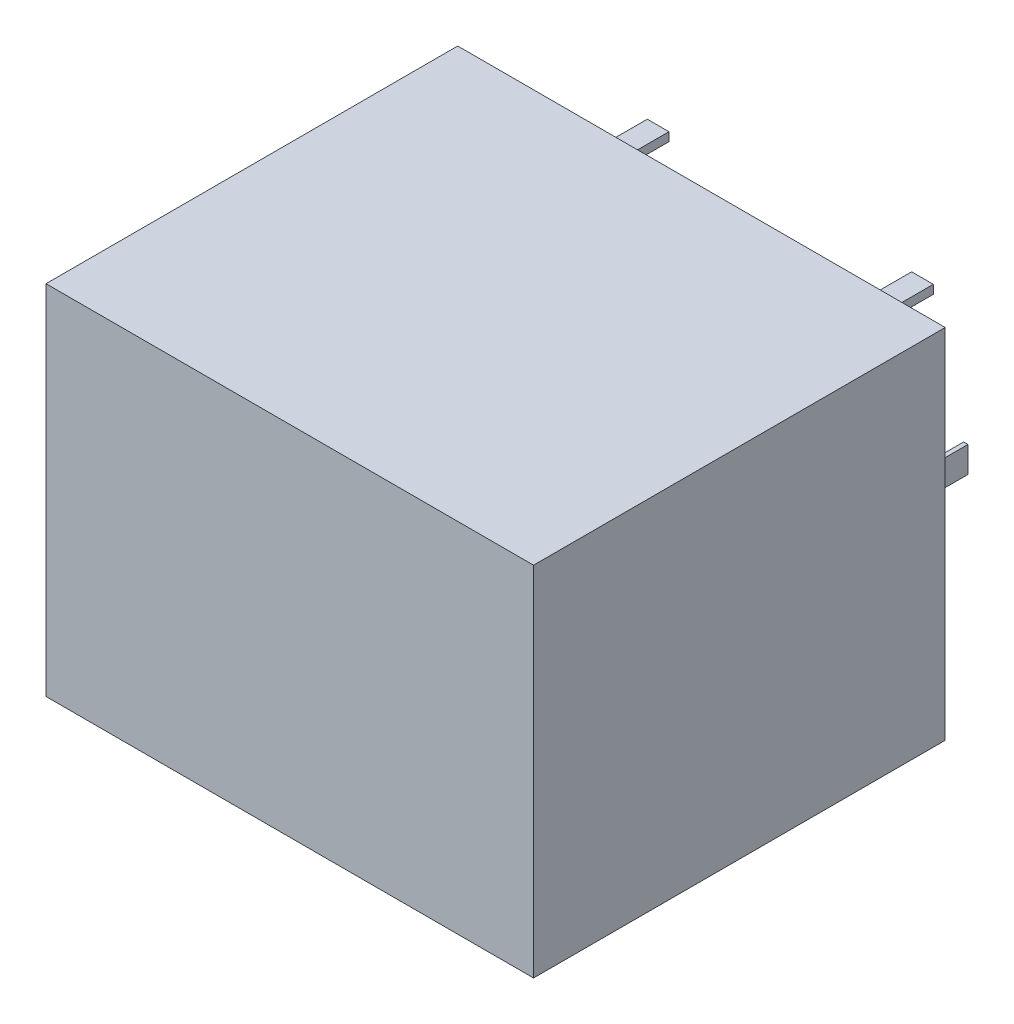
ISO-10303-21;
HEADER;
FILE_DESCRIPTION(('STEP AP214'),'2;1');
FILE_NAME('part.step','',(''),(''),'','','');
FILE_SCHEMA(('AUTOMOTIVE_DESIGN { 1 0 10303 214 1 1 1 1 }'));
ENDSEC;
DATA;
#1=APPLICATION_CONTEXT('core data for automotive mechanical design processes');
#2=APPLICATION_PROTOCOL_DEFINITION('international standard','automotive_design',2000,#1);
#3=PRODUCT_CONTEXT('',#1,'mechanical');
#4=PRODUCT('Part','Part','',(#3));
#5=PRODUCT_RELATED_PRODUCT_CATEGORY('part','',(#4));
#6=PRODUCT_DEFINITION_FORMATION('','',#4);
#7=PRODUCT_DEFINITION_CONTEXT('part definition',#1,'design');
#8=PRODUCT_DEFINITION('design','',#6,#7);
#9=PRODUCT_DEFINITION_SHAPE('','',#8);
#10=(LENGTH_UNIT() NAMED_UNIT(*) SI_UNIT(.MILLI.,.METRE.));
#11=(NAMED_UNIT(*) PLANE_ANGLE_UNIT() SI_UNIT($,.RADIAN.));
#12=(NAMED_UNIT(*) SI_UNIT($,.STERADIAN.) SOLID_ANGLE_UNIT());
#13=UNCERTAINTY_MEASURE_WITH_UNIT(LENGTH_MEASURE(1.E-05),#10,'distance_accuracy_value','');
#14=(GEOMETRIC_REPRESENTATION_CONTEXT(3) GLOBAL_UNCERTAINTY_ASSIGNED_CONTEXT((#13)) GLOBAL_UNIT_ASSIGNED_CONTEXT((#10,
#11,#12)) REPRESENTATION_CONTEXT('',''));
#15=CARTESIAN_POINT('',(0.,0.,0.));
#16=DIRECTION('',(0.,0.,1.));
#17=DIRECTION('',(1.,0.,0.));
#18=AXIS2_PLACEMENT_3D('',#15,#16,#17);
#19=CARTESIAN_POINT('',(-15.705,-5.76,-0.75));
#20=DIRECTION('',(0.,1.,0.));
#21=DIRECTION('',(0.,0.,1.));
#22=AXIS2_PLACEMENT_3D('',#19,#20,#21);
#23=PLANE('',#22);
#24=DIRECTION('',(1.,0.,0.));
#25=VECTOR('',#24,1.);
#26=CARTESIAN_POINT('',(-15.705,-5.76,-3.25));
#27=LINE('',#26,#25);
#28=CARTESIAN_POINT('',(-15.205,-5.76,-3.25));
#29=VERTEX_POINT('',#28);
#30=CARTESIAN_POINT('',(-16.205,-5.76,-3.25));
#31=VERTEX_POINT('',#30);
#32=EDGE_CURVE('E190',#29,#31,#27,.F.);
#33=ORIENTED_EDGE('',*,*,#32,.T.);
#34=DIRECTION('',(0.,0.,1.));
#35=VECTOR('',#34,1.);
#36=CARTESIAN_POINT('',(-16.205,-5.76,-0.75));
#37=LINE('',#36,#35);
#38=CARTESIAN_POINT('',(-16.205,-5.76,0.249999999999999));
#39=VERTEX_POINT('',#38);
#40=EDGE_CURVE('E179',#31,#39,#37,.T.);
#41=ORIENTED_EDGE('',*,*,#40,.T.);
#42=DIRECTION('',(1.,0.,0.));
#43=VECTOR('',#42,1.);
#44=CARTESIAN_POINT('',(-15.705,-5.76,0.25));
#45=LINE('',#44,#43);
#46=CARTESIAN_POINT('',(-15.205,-5.76,0.249999999999999));
#47=VERTEX_POINT('',#46);
#48=EDGE_CURVE('E18',#39,#47,#45,.T.);
#49=ORIENTED_EDGE('',*,*,#48,.T.);
#50=DIRECTION('',(0.,0.,1.));
#51=VECTOR('',#50,1.);
#52=CARTESIAN_POINT('',(-15.205,-5.76,-0.75));
#53=LINE('',#52,#51);
#54=EDGE_CURVE('E174',#47,#29,#53,.F.);
#55=ORIENTED_EDGE('',*,*,#54,.T.);
#56=EDGE_LOOP('',(#33,#41,#49,#55));
#57=FACE_BOUND('',#56,.T.);
#58=ADVANCED_FACE('F15',(#57),#23,.T.);
#59=CARTESIAN_POINT('',(-15.705,6.24,-0.75));
#60=DIRECTION('',(0.,1.,0.));
#61=DIRECTION('',(0.,0.,1.));
#62=AXIS2_PLACEMENT_3D('',#59,#60,#61);
#63=PLANE('',#62);
#64=DIRECTION('',(1.,0.,0.));
#65=VECTOR('',#64,1.);
#66=CARTESIAN_POINT('',(-15.705,6.24,-3.25));
#67=LINE('',#66,#65);
#68=CARTESIAN_POINT('',(-15.205,6.24,-3.25));
#69=VERTEX_POINT('',#68);
#70=CARTESIAN_POINT('',(-16.205,6.24,-3.25));
#71=VERTEX_POINT('',#70);
#72=EDGE_CURVE('E221',#69,#71,#67,.F.);
#73=ORIENTED_EDGE('',*,*,#72,.T.);
#74=DIRECTION('',(0.,0.,1.));
#75=VECTOR('',#74,1.);
#76=CARTESIAN_POINT('',(-16.205,6.24,-0.75));
#77=LINE('',#76,#75);
#78=CARTESIAN_POINT('',(-16.205,6.24,0.250000000000001));
#79=VERTEX_POINT('',#78);
#80=EDGE_CURVE('E212',#71,#79,#77,.T.);
#81=ORIENTED_EDGE('',*,*,#80,.T.);
#82=DIRECTION('',(1.,0.,0.));
#83=VECTOR('',#82,1.);
#84=CARTESIAN_POINT('',(-15.705,6.24,0.25));
#85=LINE('',#84,#83);
#86=CARTESIAN_POINT('',(-15.205,6.24,0.250000000000001));
#87=VERTEX_POINT('',#86);
#88=EDGE_CURVE('E182',#79,#87,#85,.T.);
#89=ORIENTED_EDGE('',*,*,#88,.T.);
#90=DIRECTION('',(0.,0.,1.));
#91=VECTOR('',#90,1.);
#92=CARTESIAN_POINT('',(-15.205,6.24,-0.75));
#93=LINE('',#92,#91);
#94=EDGE_CURVE('E209',#87,#69,#93,.F.);
#95=ORIENTED_EDGE('',*,*,#94,.T.);
#96=EDGE_LOOP('',(#73,#81,#89,#95));
#97=FACE_BOUND('',#96,.T.);
#98=ADVANCED_FACE('F207',(#97),#63,.T.);
#99=CARTESIAN_POINT('',(-3.505,6.24,-0.75));
#100=DIRECTION('',(0.,1.,0.));
#101=DIRECTION('',(0.,0.,1.));
#102=AXIS2_PLACEMENT_3D('',#99,#100,#101);
#103=PLANE('',#102);
#104=DIRECTION('',(1.,0.,0.));
#105=VECTOR('',#104,1.);
#106=CARTESIAN_POINT('',(-3.505,6.24,-3.25));
#107=LINE('',#106,#105);
#108=CARTESIAN_POINT('',(-3.005,6.24,-3.25));
#109=VERTEX_POINT('',#108);
#110=CARTESIAN_POINT('',(-4.005,6.24,-3.25));
#111=VERTEX_POINT('',#110);
#112=EDGE_CURVE('E342',#109,#111,#107,.F.);
#113=ORIENTED_EDGE('',*,*,#112,.T.);
#114=DIRECTION('',(0.,0.,1.));
#115=VECTOR('',#114,1.);
#116=CARTESIAN_POINT('',(-4.005,6.24,-0.75));
#117=LINE('',#116,#115);
#118=CARTESIAN_POINT('',(-4.005,6.24,0.250000000000001));
#119=VERTEX_POINT('',#118);
#120=EDGE_CURVE('E333',#111,#119,#117,.T.);
#121=ORIENTED_EDGE('',*,*,#120,.T.);
#122=DIRECTION('',(1.,0.,0.));
#123=VECTOR('',#122,1.);
#124=CARTESIAN_POINT('',(-3.505,6.24,0.25));
#125=LINE('',#124,#123);
#126=CARTESIAN_POINT('',(-3.005,6.24,0.250000000000001));
#127=VERTEX_POINT('',#126);
#128=EDGE_CURVE('E203',#119,#127,#125,.T.);
#129=ORIENTED_EDGE('',*,*,#128,.T.);
#130=DIRECTION('',(0.,0.,1.));
#131=VECTOR('',#130,1.);
#132=CARTESIAN_POINT('',(-3.005,6.24,-0.75));
#133=LINE('',#132,#131);
#134=EDGE_CURVE('E347',#127,#109,#133,.F.);
#135=ORIENTED_EDGE('',*,*,#134,.T.);
#136=EDGE_LOOP('',(#113,#121,#129,#135));
#137=FACE_BOUND('',#136,.T.);
#138=ADVANCED_FACE('F518',(#137),#103,.T.);
#139=CARTESIAN_POINT('',(-3.505,-5.76,-0.75));
#140=DIRECTION('',(0.,1.,0.));
#141=DIRECTION('',(0.,0.,1.));
#142=AXIS2_PLACEMENT_3D('',#139,#140,#141);
#143=PLANE('',#142);
#144=DIRECTION('',(1.,0.,0.));
#145=VECTOR('',#144,1.);
#146=CARTESIAN_POINT('',(-3.505,-5.76,-3.25));
#147=LINE('',#146,#145);
#148=CARTESIAN_POINT('',(-3.005,-5.76,-3.25));
#149=VERTEX_POINT('',#148);
#150=CARTESIAN_POINT('',(-4.005,-5.76,-3.25));
#151=VERTEX_POINT('',#150);
#152=EDGE_CURVE('E324',#149,#151,#147,.F.);
#153=ORIENTED_EDGE('',*,*,#152,.T.);
#154=DIRECTION('',(0.,0.,1.));
#155=VECTOR('',#154,1.);
#156=CARTESIAN_POINT('',(-4.005,-5.76,-0.75));
#157=LINE('',#156,#155);
#158=CARTESIAN_POINT('',(-4.005,-5.76,0.249999999999999));
#159=VERTEX_POINT('',#158);
#160=EDGE_CURVE('E315',#151,#159,#157,.T.);
#161=ORIENTED_EDGE('',*,*,#160,.T.);
#162=DIRECTION('',(1.,0.,0.));
#163=VECTOR('',#162,1.);
#164=CARTESIAN_POINT('',(-3.505,-5.76,0.25));
#165=LINE('',#164,#163);
#166=CARTESIAN_POINT('',(-3.005,-5.76,0.249999999999999));
#167=VERTEX_POINT('',#166);
#168=EDGE_CURVE('E198',#159,#167,#165,.T.);
#169=ORIENTED_EDGE('',*,*,#168,.T.);
#170=DIRECTION('',(0.,0.,1.));
#171=VECTOR('',#170,1.);
#172=CARTESIAN_POINT('',(-3.005,-5.76,-0.75));
#173=LINE('',#172,#171);
#174=EDGE_CURVE('E329',#167,#149,#173,.F.);
#175=ORIENTED_EDGE('',*,*,#174,.T.);
#176=EDGE_LOOP('',(#153,#161,#169,#175));
#177=FACE_BOUND('',#176,.T.);
#178=ADVANCED_FACE('F515',(#177),#143,.T.);
#179=CARTESIAN_POINT('',(-1.505,0.64,-0.75));
#180=DIRECTION('',(0.,1.,0.));
#181=DIRECTION('',(0.,0.,1.));
#182=AXIS2_PLACEMENT_3D('',#179,#180,#181);
#183=PLANE('',#182);
#184=DIRECTION('',(1.,0.,0.));
#185=VECTOR('',#184,1.);
#186=CARTESIAN_POINT('',(-1.505,0.64,-3.25));
#187=LINE('',#186,#185);
#188=CARTESIAN_POINT('',(-1.405,0.640000000000001,-3.25));
#189=VERTEX_POINT('',#188);
#190=CARTESIAN_POINT('',(-1.605,0.640000000000001,-3.25));
#191=VERTEX_POINT('',#190);
#192=EDGE_CURVE('E306',#189,#191,#187,.F.);
#193=ORIENTED_EDGE('',*,*,#192,.T.);
#194=DIRECTION('',(0.,0.,1.));
#195=VECTOR('',#194,1.);
#196=CARTESIAN_POINT('',(-1.605,0.64,-0.75));
#197=LINE('',#196,#195);
#198=CARTESIAN_POINT('',(-1.605,0.64,0.25));
#199=VERTEX_POINT('',#198);
#200=EDGE_CURVE('E297',#191,#199,#197,.T.);
#201=ORIENTED_EDGE('',*,*,#200,.T.);
#202=DIRECTION('',(1.,0.,0.));
#203=VECTOR('',#202,1.);
#204=CARTESIAN_POINT('',(-1.505,0.639999999999999,0.25));
#205=LINE('',#204,#203);
#206=CARTESIAN_POINT('',(-1.405,0.64,0.25));
#207=VERTEX_POINT('',#206);
#208=EDGE_CURVE('E196',#199,#207,#205,.T.);
#209=ORIENTED_EDGE('',*,*,#208,.T.);
#210=DIRECTION('',(0.,0.,1.));
#211=VECTOR('',#210,1.);
#212=CARTESIAN_POINT('',(-1.405,0.64,-0.75));
#213=LINE('',#212,#211);
#214=EDGE_CURVE('E311',#207,#189,#213,.F.);
#215=ORIENTED_EDGE('',*,*,#214,.T.);
#216=EDGE_LOOP('',(#193,#201,#209,#215));
#217=FACE_BOUND('',#216,.T.);
#218=ADVANCED_FACE('F465',(#217),#183,.T.);
#219=CARTESIAN_POINT('',(-15.205,-5.96,-0.75));
#220=DIRECTION('',(-1.,0.,0.));
#221=DIRECTION('',(0.,-1.,0.));
#222=AXIS2_PLACEMENT_3D('',#219,#220,#221);
#223=PLANE('',#222);
#224=DIRECTION('',(0.,0.,1.));
#225=VECTOR('',#224,1.);
#226=CARTESIAN_POINT('',(-15.205,-6.16,-0.75));
#227=LINE('',#226,#225);
#228=CARTESIAN_POINT('',(-15.205,-6.16,0.249999999999999));
#229=VERTEX_POINT('',#228);
#230=CARTESIAN_POINT('',(-15.205,-6.16,-3.25));
#231=VERTEX_POINT('',#230);
#232=EDGE_CURVE('E250',#229,#231,#227,.F.);
#233=ORIENTED_EDGE('',*,*,#232,.T.);
#234=DIRECTION('',(0.,-1.,0.));
#235=VECTOR('',#234,1.);
#236=CARTESIAN_POINT('',(-15.205,-5.96,-3.25));
#237=LINE('',#236,#235);
#238=EDGE_CURVE('E194',#231,#29,#237,.F.);
#239=ORIENTED_EDGE('',*,*,#238,.T.);
#240=ORIENTED_EDGE('',*,*,#54,.F.);
#241=DIRECTION('',(0.,-1.,0.));
#242=VECTOR('',#241,1.);
#243=CARTESIAN_POINT('',(-15.205,-5.96,0.25));
#244=LINE('',#243,#242);
#245=EDGE_CURVE('E184',#229,#47,#244,.F.);
#246=ORIENTED_EDGE('',*,*,#245,.F.);
#247=EDGE_LOOP('',(#233,#239,#240,#246));
#248=FACE_BOUND('',#247,.T.);
#249=ADVANCED_FACE('F192',(#248),#223,.F.);
#250=CARTESIAN_POINT('',(-15.705,-5.96,-3.25));
#251=DIRECTION('',(0.,0.,1.));
#252=DIRECTION('',(0.,-1.,0.));
#253=AXIS2_PLACEMENT_3D('',#250,#251,#252);
#254=PLANE('',#253);
#255=DIRECTION('',(1.,0.,0.));
#256=VECTOR('',#255,1.);
#257=CARTESIAN_POINT('',(-15.705,-6.16,-3.25));
#258=LINE('',#257,#256);
#259=CARTESIAN_POINT('',(-16.205,-6.16,-3.25));
#260=VERTEX_POINT('',#259);
#261=EDGE_CURVE('E240',#231,#260,#258,.F.);
#262=ORIENTED_EDGE('',*,*,#261,.T.);
#263=DIRECTION('',(0.,1.,0.));
#264=VECTOR('',#263,1.);
#265=CARTESIAN_POINT('',(-16.205,-5.96,-3.25));
#266=LINE('',#265,#264);
#267=EDGE_CURVE('E233',#260,#31,#266,.T.);
#268=ORIENTED_EDGE('',*,*,#267,.T.);
#269=ORIENTED_EDGE('',*,*,#32,.F.);
#270=ORIENTED_EDGE('',*,*,#238,.F.);
#271=EDGE_LOOP('',(#262,#268,#269,#270));
#272=FACE_BOUND('',#271,.T.);
#273=ADVANCED_FACE('F238',(#272),#254,.F.);
#274=CARTESIAN_POINT('',(-16.205,-5.96,-0.75));
#275=DIRECTION('',(1.,0.,0.));
#276=DIRECTION('',(0.,1.,0.));
#277=AXIS2_PLACEMENT_3D('',#274,#275,#276);
#278=PLANE('',#277);
#279=ORIENTED_EDGE('',*,*,#40,.F.);
#280=ORIENTED_EDGE('',*,*,#267,.F.);
#281=DIRECTION('',(0.,0.,1.));
#282=VECTOR('',#281,1.);
#283=CARTESIAN_POINT('',(-16.205,-6.16,-0.75));
#284=LINE('',#283,#282);
#285=CARTESIAN_POINT('',(-16.205,-6.16,0.249999999999999));
#286=VERTEX_POINT('',#285);
#287=EDGE_CURVE('E245',#260,#286,#284,.T.);
#288=ORIENTED_EDGE('',*,*,#287,.T.);
#289=DIRECTION('',(0.,1.,0.));
#290=VECTOR('',#289,1.);
#291=CARTESIAN_POINT('',(-16.205,-5.96,0.25));
#292=LINE('',#291,#290);
#293=EDGE_CURVE('E227',#39,#286,#292,.F.);
#294=ORIENTED_EDGE('',*,*,#293,.F.);
#295=EDGE_LOOP('',(#279,#280,#288,#294));
#296=FACE_BOUND('',#295,.T.);
#297=ADVANCED_FACE('F244',(#296),#278,.F.);
#298=CARTESIAN_POINT('',(-15.205,6.04,-0.75));
#299=DIRECTION('',(-1.,0.,0.));
#300=DIRECTION('',(0.,-1.,0.));
#301=AXIS2_PLACEMENT_3D('',#298,#299,#300);
#302=PLANE('',#301);
#303=DIRECTION('',(0.,0.,1.));
#304=VECTOR('',#303,1.);
#305=CARTESIAN_POINT('',(-15.205,5.84,-0.75));
#306=LINE('',#305,#304);
#307=CARTESIAN_POINT('',(-15.205,5.84,0.250000000000001));
#308=VERTEX_POINT('',#307);
#309=CARTESIAN_POINT('',(-15.205,5.84,-3.25));
#310=VERTEX_POINT('',#309);
#311=EDGE_CURVE('E247',#308,#310,#306,.F.);
#312=ORIENTED_EDGE('',*,*,#311,.T.);
#313=DIRECTION('',(0.,-1.,0.));
#314=VECTOR('',#313,1.);
#315=CARTESIAN_POINT('',(-15.205,6.04,-3.25));
#316=LINE('',#315,#314);
#317=EDGE_CURVE('E225',#310,#69,#316,.F.);
#318=ORIENTED_EDGE('',*,*,#317,.T.);
#319=ORIENTED_EDGE('',*,*,#94,.F.);
#320=DIRECTION('',(0.,-1.,0.));
#321=VECTOR('',#320,1.);
#322=CARTESIAN_POINT('',(-15.205,6.04,0.25));
#323=LINE('',#322,#321);
#324=EDGE_CURVE('E216',#308,#87,#323,.F.);
#325=ORIENTED_EDGE('',*,*,#324,.F.);
#326=EDGE_LOOP('',(#312,#318,#319,#325));
#327=FACE_BOUND('',#326,.T.);
#328=ADVANCED_FACE('F223',(#327),#302,.F.);
#329=CARTESIAN_POINT('',(-15.705,6.04,-3.25));
#330=DIRECTION('',(0.,0.,1.));
#331=DIRECTION('',(0.,-1.,0.));
#332=AXIS2_PLACEMENT_3D('',#329,#330,#331);
#333=PLANE('',#332);
#334=DIRECTION('',(1.,0.,0.));
#335=VECTOR('',#334,1.);
#336=CARTESIAN_POINT('',(-15.705,5.84,-3.25));
#337=LINE('',#336,#335);
#338=CARTESIAN_POINT('',(-16.205,5.84,-3.25));
#339=VERTEX_POINT('',#338);
#340=EDGE_CURVE('E290',#310,#339,#337,.F.);
#341=ORIENTED_EDGE('',*,*,#340,.T.);
#342=DIRECTION('',(0.,1.,0.));
#343=VECTOR('',#342,1.);
#344=CARTESIAN_POINT('',(-16.205,6.04,-3.25));
#345=LINE('',#344,#343);
#346=EDGE_CURVE('E352',#339,#71,#345,.T.);
#347=ORIENTED_EDGE('',*,*,#346,.T.);
#348=ORIENTED_EDGE('',*,*,#72,.F.);
#349=ORIENTED_EDGE('',*,*,#317,.F.);
#350=EDGE_LOOP('',(#341,#347,#348,#349));
#351=FACE_BOUND('',#350,.T.);
#352=ADVANCED_FACE('F357',(#351),#333,.F.);
#353=CARTESIAN_POINT('',(-16.205,6.04,-0.75));
#354=DIRECTION('',(1.,0.,0.));
#355=DIRECTION('',(0.,1.,0.));
#356=AXIS2_PLACEMENT_3D('',#353,#354,#355);
#357=PLANE('',#356);
#358=ORIENTED_EDGE('',*,*,#80,.F.);
#359=ORIENTED_EDGE('',*,*,#346,.F.);
#360=DIRECTION('',(0.,0.,1.));
#361=VECTOR('',#360,1.);
#362=CARTESIAN_POINT('',(-16.205,5.84,-0.75));
#363=LINE('',#362,#361);
#364=CARTESIAN_POINT('',(-16.205,5.84,0.250000000000001));
#365=VERTEX_POINT('',#364);
#366=EDGE_CURVE('E287',#339,#365,#363,.T.);
#367=ORIENTED_EDGE('',*,*,#366,.T.);
#368=DIRECTION('',(0.,1.,0.));
#369=VECTOR('',#368,1.);
#370=CARTESIAN_POINT('',(-16.205,6.04,0.25));
#371=LINE('',#370,#369);
#372=EDGE_CURVE('E349',#79,#365,#371,.F.);
#373=ORIENTED_EDGE('',*,*,#372,.F.);
#374=EDGE_LOOP('',(#358,#359,#367,#373));
#375=FACE_BOUND('',#374,.T.);
#376=ADVANCED_FACE('F361',(#375),#357,.F.);
#377=CARTESIAN_POINT('',(-3.005,6.04,-0.75));
#378=DIRECTION('',(-1.,0.,0.));
#379=DIRECTION('',(0.,-1.,0.));
#380=AXIS2_PLACEMENT_3D('',#377,#378,#379);
#381=PLANE('',#380);
#382=DIRECTION('',(0.,0.,1.));
#383=VECTOR('',#382,1.);
#384=CARTESIAN_POINT('',(-3.005,5.84,-0.75));
#385=LINE('',#384,#383);
#386=CARTESIAN_POINT('',(-3.005,5.84,0.250000000000001));
#387=VERTEX_POINT('',#386);
#388=CARTESIAN_POINT('',(-3.005,5.84,-3.25));
#389=VERTEX_POINT('',#388);
#390=EDGE_CURVE('E285',#387,#389,#385,.F.);
#391=ORIENTED_EDGE('',*,*,#390,.T.);
#392=DIRECTION('',(0.,-1.,0.));
#393=VECTOR('',#392,1.);
#394=CARTESIAN_POINT('',(-3.005,6.04,-3.25));
#395=LINE('',#394,#393);
#396=EDGE_CURVE('E339',#389,#109,#395,.F.);
#397=ORIENTED_EDGE('',*,*,#396,.T.);
#398=ORIENTED_EDGE('',*,*,#134,.F.);
#399=DIRECTION('',(0.,-1.,0.));
#400=VECTOR('',#399,1.);
#401=CARTESIAN_POINT('',(-3.005,6.04,0.25));
#402=LINE('',#401,#400);
#403=EDGE_CURVE('E344',#387,#127,#402,.F.);
#404=ORIENTED_EDGE('',*,*,#403,.F.);
#405=EDGE_LOOP('',(#391,#397,#398,#404));
#406=FACE_BOUND('',#405,.T.);
#407=ADVANCED_FACE('F496',(#406),#381,.F.);
#408=CARTESIAN_POINT('',(-3.505,6.04,-3.25));
#409=DIRECTION('',(0.,0.,1.));
#410=DIRECTION('',(0.,-1.,0.));
#411=AXIS2_PLACEMENT_3D('',#408,#409,#410);
#412=PLANE('',#411);
#413=DIRECTION('',(1.,0.,0.));
#414=VECTOR('',#413,1.);
#415=CARTESIAN_POINT('',(-3.505,5.84,-3.25));
#416=LINE('',#415,#414);
#417=CARTESIAN_POINT('',(-4.005,5.84,-3.25));
#418=VERTEX_POINT('',#417);
#419=EDGE_CURVE('E283',#389,#418,#416,.F.);
#420=ORIENTED_EDGE('',*,*,#419,.T.);
#421=DIRECTION('',(0.,1.,0.));
#422=VECTOR('',#421,1.);
#423=CARTESIAN_POINT('',(-4.005,6.04,-3.25));
#424=LINE('',#423,#422);
#425=EDGE_CURVE('E336',#418,#111,#424,.T.);
#426=ORIENTED_EDGE('',*,*,#425,.T.);
#427=ORIENTED_EDGE('',*,*,#112,.F.);
#428=ORIENTED_EDGE('',*,*,#396,.F.);
#429=EDGE_LOOP('',(#420,#426,#427,#428));
#430=FACE_BOUND('',#429,.T.);
#431=ADVANCED_FACE('F492',(#430),#412,.F.);
#432=CARTESIAN_POINT('',(-4.005,6.04,-0.75));
#433=DIRECTION('',(1.,0.,0.));
#434=DIRECTION('',(0.,1.,0.));
#435=AXIS2_PLACEMENT_3D('',#432,#433,#434);
#436=PLANE('',#435);
#437=ORIENTED_EDGE('',*,*,#120,.F.);
#438=ORIENTED_EDGE('',*,*,#425,.F.);
#439=DIRECTION('',(0.,0.,1.));
#440=VECTOR('',#439,1.);
#441=CARTESIAN_POINT('',(-4.005,5.84,-0.75));
#442=LINE('',#441,#440);
#443=CARTESIAN_POINT('',(-4.005,5.84,0.250000000000001));
#444=VERTEX_POINT('',#443);
#445=EDGE_CURVE('E280',#418,#444,#442,.T.);
#446=ORIENTED_EDGE('',*,*,#445,.T.);
#447=DIRECTION('',(0.,1.,0.));
#448=VECTOR('',#447,1.);
#449=CARTESIAN_POINT('',(-4.005,6.04,0.25));
#450=LINE('',#449,#448);
#451=EDGE_CURVE('E331',#119,#444,#450,.F.);
#452=ORIENTED_EDGE('',*,*,#451,.F.);
#453=EDGE_LOOP('',(#437,#438,#446,#452));
#454=FACE_BOUND('',#453,.T.);
#455=ADVANCED_FACE('F489',(#454),#436,.F.);
#456=CARTESIAN_POINT('',(-3.005,-5.96,-0.75));
#457=DIRECTION('',(-1.,0.,0.));
#458=DIRECTION('',(0.,-1.,0.));
#459=AXIS2_PLACEMENT_3D('',#456,#457,#458);
#460=PLANE('',#459);
#461=DIRECTION('',(0.,0.,1.));
#462=VECTOR('',#461,1.);
#463=CARTESIAN_POINT('',(-3.005,-6.16,-0.75));
#464=LINE('',#463,#462);
#465=CARTESIAN_POINT('',(-3.005,-6.16,0.249999999999999));
#466=VERTEX_POINT('',#465);
#467=CARTESIAN_POINT('',(-3.005,-6.16,-3.25));
#468=VERTEX_POINT('',#467);
#469=EDGE_CURVE('E278',#466,#468,#464,.F.);
#470=ORIENTED_EDGE('',*,*,#469,.T.);
#471=DIRECTION('',(0.,-1.,0.));
#472=VECTOR('',#471,1.);
#473=CARTESIAN_POINT('',(-3.005,-5.96,-3.25));
#474=LINE('',#473,#472);
#475=EDGE_CURVE('E321',#468,#149,#474,.F.);
#476=ORIENTED_EDGE('',*,*,#475,.T.);
#477=ORIENTED_EDGE('',*,*,#174,.F.);
#478=DIRECTION('',(0.,-1.,0.));
#479=VECTOR('',#478,1.);
#480=CARTESIAN_POINT('',(-3.005,-5.96,0.25));
#481=LINE('',#480,#479);
#482=EDGE_CURVE('E326',#466,#167,#481,.F.);
#483=ORIENTED_EDGE('',*,*,#482,.F.);
#484=EDGE_LOOP('',(#470,#476,#477,#483));
#485=FACE_BOUND('',#484,.T.);
#486=ADVANCED_FACE('F428',(#485),#460,.F.);
#487=CARTESIAN_POINT('',(-3.505,-5.96,-3.25));
#488=DIRECTION('',(0.,0.,1.));
#489=DIRECTION('',(0.,-1.,0.));
#490=AXIS2_PLACEMENT_3D('',#487,#488,#489);
#491=PLANE('',#490);
#492=DIRECTION('',(1.,0.,0.));
#493=VECTOR('',#492,1.);
#494=CARTESIAN_POINT('',(-3.505,-6.16,-3.25));
#495=LINE('',#494,#493);
#496=CARTESIAN_POINT('',(-4.005,-6.16,-3.25));
#497=VERTEX_POINT('',#496);
#498=EDGE_CURVE('E276',#468,#497,#495,.F.);
#499=ORIENTED_EDGE('',*,*,#498,.T.);
#500=DIRECTION('',(0.,1.,0.));
#501=VECTOR('',#500,1.);
#502=CARTESIAN_POINT('',(-4.005,-5.96,-3.25));
#503=LINE('',#502,#501);
#504=EDGE_CURVE('E318',#497,#151,#503,.T.);
#505=ORIENTED_EDGE('',*,*,#504,.T.);
#506=ORIENTED_EDGE('',*,*,#152,.F.);
#507=ORIENTED_EDGE('',*,*,#475,.F.);
#508=EDGE_LOOP('',(#499,#505,#506,#507));
#509=FACE_BOUND('',#508,.T.);
#510=ADVANCED_FACE('F424',(#509),#491,.F.);
#511=CARTESIAN_POINT('',(-4.005,-5.96,-0.75));
#512=DIRECTION('',(1.,0.,0.));
#513=DIRECTION('',(0.,1.,0.));
#514=AXIS2_PLACEMENT_3D('',#511,#512,#513);
#515=PLANE('',#514);
#516=ORIENTED_EDGE('',*,*,#160,.F.);
#517=ORIENTED_EDGE('',*,*,#504,.F.);
#518=DIRECTION('',(0.,0.,1.));
#519=VECTOR('',#518,1.);
#520=CARTESIAN_POINT('',(-4.005,-6.16,-0.75));
#521=LINE('',#520,#519);
#522=CARTESIAN_POINT('',(-4.005,-6.16,0.249999999999999));
#523=VERTEX_POINT('',#522);
#524=EDGE_CURVE('E273',#497,#523,#521,.T.);
#525=ORIENTED_EDGE('',*,*,#524,.T.);
#526=DIRECTION('',(0.,1.,0.));
#527=VECTOR('',#526,1.);
#528=CARTESIAN_POINT('',(-4.005,-5.96,0.25));
#529=LINE('',#528,#527);
#530=EDGE_CURVE('E313',#159,#523,#529,.F.);
#531=ORIENTED_EDGE('',*,*,#530,.F.);
#532=EDGE_LOOP('',(#516,#517,#525,#531));
#533=FACE_BOUND('',#532,.T.);
#534=ADVANCED_FACE('F421',(#533),#515,.F.);
#535=CARTESIAN_POINT('',(-1.405,0.04,-0.75));
#536=DIRECTION('',(-1.,0.,0.));
#537=DIRECTION('',(0.,-1.,0.));
#538=AXIS2_PLACEMENT_3D('',#535,#536,#537);
#539=PLANE('',#538);
#540=DIRECTION('',(0.,0.,1.));
#541=VECTOR('',#540,1.);
#542=CARTESIAN_POINT('',(-1.405,-0.56,-0.75));
#543=LINE('',#542,#541);
#544=CARTESIAN_POINT('',(-1.405,-0.56,0.25));
#545=VERTEX_POINT('',#544);
#546=CARTESIAN_POINT('',(-1.405,-0.559999999999999,-3.25));
#547=VERTEX_POINT('',#546);
#548=EDGE_CURVE('E271',#545,#547,#543,.F.);
#549=ORIENTED_EDGE('',*,*,#548,.T.);
#550=DIRECTION('',(0.,-1.,0.));
#551=VECTOR('',#550,1.);
#552=CARTESIAN_POINT('',(-1.405,0.04,-3.25));
#553=LINE('',#552,#551);
#554=EDGE_CURVE('E303',#547,#189,#553,.F.);
#555=ORIENTED_EDGE('',*,*,#554,.T.);
#556=ORIENTED_EDGE('',*,*,#214,.F.);
#557=DIRECTION('',(0.,-1.,0.));
#558=VECTOR('',#557,1.);
#559=CARTESIAN_POINT('',(-1.405,0.04,0.25));
#560=LINE('',#559,#558);
#561=EDGE_CURVE('E308',#545,#207,#560,.F.);
#562=ORIENTED_EDGE('',*,*,#561,.F.);
#563=EDGE_LOOP('',(#549,#555,#556,#562));
#564=FACE_BOUND('',#563,.T.);
#565=ADVANCED_FACE('F461',(#564),#539,.F.);
#566=CARTESIAN_POINT('',(-1.505,0.04,-3.25));
#567=DIRECTION('',(0.,0.,1.));
#568=DIRECTION('',(0.,-1.,0.));
#569=AXIS2_PLACEMENT_3D('',#566,#567,#568);
#570=PLANE('',#569);
#571=DIRECTION('',(1.,0.,0.));
#572=VECTOR('',#571,1.);
#573=CARTESIAN_POINT('',(-1.505,-0.559999999999998,-3.25));
#574=LINE('',#573,#572);
#575=CARTESIAN_POINT('',(-1.605,-0.559999999999999,-3.25));
#576=VERTEX_POINT('',#575);
#577=EDGE_CURVE('E269',#547,#576,#574,.F.);
#578=ORIENTED_EDGE('',*,*,#577,.T.);
#579=DIRECTION('',(0.,1.,0.));
#580=VECTOR('',#579,1.);
#581=CARTESIAN_POINT('',(-1.605,0.04,-3.25));
#582=LINE('',#581,#580);
#583=EDGE_CURVE('E300',#576,#191,#582,.T.);
#584=ORIENTED_EDGE('',*,*,#583,.T.);
#585=ORIENTED_EDGE('',*,*,#192,.F.);
#586=ORIENTED_EDGE('',*,*,#554,.F.);
#587=EDGE_LOOP('',(#578,#584,#585,#586));
#588=FACE_BOUND('',#587,.T.);
#589=ADVANCED_FACE('F473',(#588),#570,.F.);
#590=CARTESIAN_POINT('',(-1.605,0.04,-0.75));
#591=DIRECTION('',(1.,0.,0.));
#592=DIRECTION('',(0.,1.,0.));
#593=AXIS2_PLACEMENT_3D('',#590,#591,#592);
#594=PLANE('',#593);
#595=ORIENTED_EDGE('',*,*,#200,.F.);
#596=ORIENTED_EDGE('',*,*,#583,.F.);
#597=DIRECTION('',(0.,0.,1.));
#598=VECTOR('',#597,1.);
#599=CARTESIAN_POINT('',(-1.605,-0.56,-0.75));
#600=LINE('',#599,#598);
#601=CARTESIAN_POINT('',(-1.605,-0.56,0.25));
#602=VERTEX_POINT('',#601);
#603=EDGE_CURVE('E266',#576,#602,#600,.T.);
#604=ORIENTED_EDGE('',*,*,#603,.T.);
#605=DIRECTION('',(0.,1.,0.));
#606=VECTOR('',#605,1.);
#607=CARTESIAN_POINT('',(-1.605,0.04,0.25));
#608=LINE('',#607,#606);
#609=EDGE_CURVE('E295',#199,#602,#608,.F.);
#610=ORIENTED_EDGE('',*,*,#609,.F.);
#611=EDGE_LOOP('',(#595,#596,#604,#610));
#612=FACE_BOUND('',#611,.T.);
#613=ADVANCED_FACE('F375',(#612),#594,.F.);
#614=CARTESIAN_POINT('',(-15.705,-6.16,-0.75));
#615=DIRECTION('',(0.,1.,0.));
#616=DIRECTION('',(0.,0.,1.));
#617=AXIS2_PLACEMENT_3D('',#614,#615,#616);
#618=PLANE('',#617);
#619=ORIENTED_EDGE('',*,*,#287,.F.);
#620=ORIENTED_EDGE('',*,*,#261,.F.);
#621=ORIENTED_EDGE('',*,*,#232,.F.);
#622=DIRECTION('',(1.,0.,0.));
#623=VECTOR('',#622,1.);
#624=CARTESIAN_POINT('',(-10.205,-6.16,0.249999999999995));
#625=LINE('',#624,#623);
#626=EDGE_CURVE('E187',#229,#286,#625,.F.);
#627=ORIENTED_EDGE('',*,*,#626,.T.);
#628=EDGE_LOOP('',(#619,#620,#621,#627));
#629=FACE_BOUND('',#628,.T.);
#630=ADVANCED_FACE('F249',(#629),#618,.F.);
#631=CARTESIAN_POINT('',(-15.705,5.84,-0.75));
#632=DIRECTION('',(0.,1.,0.));
#633=DIRECTION('',(0.,0.,1.));
#634=AXIS2_PLACEMENT_3D('',#631,#632,#633);
#635=PLANE('',#634);
#636=ORIENTED_EDGE('',*,*,#366,.F.);
#637=ORIENTED_EDGE('',*,*,#340,.F.);
#638=ORIENTED_EDGE('',*,*,#311,.F.);
#639=DIRECTION('',(1.,0.,0.));
#640=VECTOR('',#639,1.);
#641=CARTESIAN_POINT('',(-10.205,5.84,0.250000000000004));
#642=LINE('',#641,#640);
#643=EDGE_CURVE('E218',#308,#365,#642,.F.);
#644=ORIENTED_EDGE('',*,*,#643,.T.);
#645=EDGE_LOOP('',(#636,#637,#638,#644));
#646=FACE_BOUND('',#645,.T.);
#647=ADVANCED_FACE('F363',(#646),#635,.F.);
#648=CARTESIAN_POINT('',(-3.505,5.84,-0.75));
#649=DIRECTION('',(0.,1.,0.));
#650=DIRECTION('',(0.,0.,1.));
#651=AXIS2_PLACEMENT_3D('',#648,#649,#650);
#652=PLANE('',#651);
#653=ORIENTED_EDGE('',*,*,#445,.F.);
#654=ORIENTED_EDGE('',*,*,#419,.F.);
#655=ORIENTED_EDGE('',*,*,#390,.F.);
#656=DIRECTION('',(1.,0.,0.));
#657=VECTOR('',#656,1.);
#658=CARTESIAN_POINT('',(-10.205,5.84,0.250000000000004));
#659=LINE('',#658,#657);
#660=EDGE_CURVE('E253',#387,#444,#659,.F.);
#661=ORIENTED_EDGE('',*,*,#660,.T.);
#662=EDGE_LOOP('',(#653,#654,#655,#661));
#663=FACE_BOUND('',#662,.T.);
#664=ADVANCED_FACE('F365',(#663),#652,.F.);
#665=CARTESIAN_POINT('',(-3.505,-6.16,-0.75));
#666=DIRECTION('',(0.,1.,0.));
#667=DIRECTION('',(0.,0.,1.));
#668=AXIS2_PLACEMENT_3D('',#665,#666,#667);
#669=PLANE('',#668);
#670=ORIENTED_EDGE('',*,*,#524,.F.);
#671=ORIENTED_EDGE('',*,*,#498,.F.);
#672=ORIENTED_EDGE('',*,*,#469,.F.);
#673=DIRECTION('',(1.,0.,0.));
#674=VECTOR('',#673,1.);
#675=CARTESIAN_POINT('',(-10.205,-6.16,0.249999999999995));
#676=LINE('',#675,#674);
#677=EDGE_CURVE('E416',#466,#523,#676,.F.);
#678=ORIENTED_EDGE('',*,*,#677,.T.);
#679=EDGE_LOOP('',(#670,#671,#672,#678));
#680=FACE_BOUND('',#679,.T.);
#681=ADVANCED_FACE('F372',(#680),#669,.F.);
#682=CARTESIAN_POINT('',(-1.505,-0.56,-0.75));
#683=DIRECTION('',(0.,1.,0.));
#684=DIRECTION('',(0.,0.,1.));
#685=AXIS2_PLACEMENT_3D('',#682,#683,#684);
#686=PLANE('',#685);
#687=ORIENTED_EDGE('',*,*,#603,.F.);
#688=ORIENTED_EDGE('',*,*,#577,.F.);
#689=ORIENTED_EDGE('',*,*,#548,.F.);
#690=DIRECTION('',(1.,0.,0.));
#691=VECTOR('',#690,1.);
#692=CARTESIAN_POINT('',(-10.205,-0.56,0.25));
#693=LINE('',#692,#691);
#694=EDGE_CURVE('E431',#545,#602,#693,.F.);
#695=ORIENTED_EDGE('',*,*,#694,.T.);
#696=EDGE_LOOP('',(#687,#688,#689,#695));
#697=FACE_BOUND('',#696,.T.);
#698=ADVANCED_FACE('F402',(#697),#686,.F.);
#699=CARTESIAN_POINT('',(-10.205,-8.21,9.75));
#700=DIRECTION('',(0.,1.,0.));
#701=DIRECTION('',(0.,0.,1.));
#702=AXIS2_PLACEMENT_3D('',#699,#700,#701);
#703=PLANE('',#702);
#704=DIRECTION('',(1.,0.,0.));
#705=VECTOR('',#704,1.);
#706=CARTESIAN_POINT('',(-10.205,-8.21,0.249999999999994));
#707=LINE('',#706,#705);
#708=CARTESIAN_POINT('',(-21.455,-8.21,0.249999999999999));
#709=VERTEX_POINT('',#708);
#710=CARTESIAN_POINT('',(1.045,-8.21,0.249999999999999));
#711=VERTEX_POINT('',#710);
#712=EDGE_CURVE('E440',#709,#711,#707,.T.);
#713=ORIENTED_EDGE('',*,*,#712,.T.);
#714=DIRECTION('',(0.,0.,1.));
#715=VECTOR('',#714,1.);
#716=CARTESIAN_POINT('',(1.045,-8.21,9.75));
#717=LINE('',#716,#715);
#718=CARTESIAN_POINT('',(1.045,-8.21000000000001,19.25));
#719=VERTEX_POINT('',#718);
#720=EDGE_CURVE('E255',#711,#719,#717,.T.);
#721=ORIENTED_EDGE('',*,*,#720,.T.);
#722=DIRECTION('',(1.,0.,0.));
#723=VECTOR('',#722,1.);
#724=CARTESIAN_POINT('',(-10.205,-8.21,19.25));
#725=LINE('',#724,#723);
#726=CARTESIAN_POINT('',(-21.455,-8.21,19.25));
#727=VERTEX_POINT('',#726);
#728=EDGE_CURVE('E262',#719,#727,#725,.F.);
#729=ORIENTED_EDGE('',*,*,#728,.T.);
#730=DIRECTION('',(0.,0.,1.));
#731=VECTOR('',#730,1.);
#732=CARTESIAN_POINT('',(-21.455,-8.21,9.75));
#733=LINE('',#732,#731);
#734=EDGE_CURVE('E264',#727,#709,#733,.F.);
#735=ORIENTED_EDGE('',*,*,#734,.T.);
#736=EDGE_LOOP('',(#713,#721,#729,#735));
#737=FACE_BOUND('',#736,.T.);
#738=ADVANCED_FACE('F398',(#737),#703,.F.);
#739=CARTESIAN_POINT('',(-21.455,0.04,9.75));
#740=DIRECTION('',(1.,0.,0.));
#741=DIRECTION('',(0.,1.,0.));
#742=AXIS2_PLACEMENT_3D('',#739,#740,#741);
#743=PLANE('',#742);
#744=ORIENTED_EDGE('',*,*,#734,.F.);
#745=DIRECTION('',(0.,1.,0.));
#746=VECTOR('',#745,1.);
#747=CARTESIAN_POINT('',(-21.455,0.03999999999999,19.25));
#748=LINE('',#747,#746);
#749=CARTESIAN_POINT('',(-21.455,8.29,19.25));
#750=VERTEX_POINT('',#749);
#751=EDGE_CURVE('E260',#727,#750,#748,.T.);
#752=ORIENTED_EDGE('',*,*,#751,.T.);
#753=DIRECTION('',(0.,0.,1.));
#754=VECTOR('',#753,1.);
#755=CARTESIAN_POINT('',(-21.455,8.29,9.75));
#756=LINE('',#755,#754);
#757=CARTESIAN_POINT('',(-21.455,8.29,0.250000000000002));
#758=VERTEX_POINT('',#757);
#759=EDGE_CURVE('E443',#758,#750,#756,.T.);
#760=ORIENTED_EDGE('',*,*,#759,.F.);
#761=DIRECTION('',(0.,-1.,0.));
#762=VECTOR('',#761,1.);
#763=CARTESIAN_POINT('',(-21.455,0.04,0.25));
#764=LINE('',#763,#762);
#765=EDGE_CURVE('E434',#758,#709,#764,.T.);
#766=ORIENTED_EDGE('',*,*,#765,.T.);
#767=EDGE_LOOP('',(#744,#752,#760,#766));
#768=FACE_BOUND('',#767,.T.);
#769=ADVANCED_FACE('F394',(#768),#743,.F.);
#770=CARTESIAN_POINT('',(-10.205,0.03999999999999,19.25));
#771=DIRECTION('',(0.,0.,-1.));
#772=DIRECTION('',(0.,1.,0.));
#773=AXIS2_PLACEMENT_3D('',#770,#771,#772);
#774=PLANE('',#773);
#775=ORIENTED_EDGE('',*,*,#728,.F.);
#776=DIRECTION('',(0.,-1.,0.));
#777=VECTOR('',#776,1.);
#778=CARTESIAN_POINT('',(1.045,0.03999999999999,19.25));
#779=LINE('',#778,#777);
#780=CARTESIAN_POINT('',(1.045,8.29,19.25));
#781=VERTEX_POINT('',#780);
#782=EDGE_CURVE('E251',#719,#781,#779,.F.);
#783=ORIENTED_EDGE('',*,*,#782,.T.);
#784=DIRECTION('',(1.,0.,0.));
#785=VECTOR('',#784,1.);
#786=CARTESIAN_POINT('',(-10.205,8.28999999999999,19.25));
#787=LINE('',#786,#785);
#788=EDGE_CURVE('E446',#750,#781,#787,.T.);
#789=ORIENTED_EDGE('',*,*,#788,.F.);
#790=ORIENTED_EDGE('',*,*,#751,.F.);
#791=EDGE_LOOP('',(#775,#783,#789,#790));
#792=FACE_BOUND('',#791,.T.);
#793=ADVANCED_FACE('F391',(#792),#774,.F.);
#794=CARTESIAN_POINT('',(1.045,0.03999999999999,9.75));
#795=DIRECTION('',(-1.,0.,0.));
#796=DIRECTION('',(0.,-1.,0.));
#797=AXIS2_PLACEMENT_3D('',#794,#795,#796);
#798=PLANE('',#797);
#799=ORIENTED_EDGE('',*,*,#720,.F.);
#800=DIRECTION('',(0.,-1.,0.));
#801=VECTOR('',#800,1.);
#802=CARTESIAN_POINT('',(1.045,0.04,0.25));
#803=LINE('',#802,#801);
#804=CARTESIAN_POINT('',(1.045,8.29,0.250000000000002));
#805=VERTEX_POINT('',#804);
#806=EDGE_CURVE('E33',#711,#805,#803,.F.);
#807=ORIENTED_EDGE('',*,*,#806,.T.);
#808=DIRECTION('',(0.,0.,1.));
#809=VECTOR('',#808,1.);
#810=CARTESIAN_POINT('',(1.045,8.28999999999999,9.75));
#811=LINE('',#810,#809);
#812=EDGE_CURVE('E24',#781,#805,#811,.F.);
#813=ORIENTED_EDGE('',*,*,#812,.F.);
#814=ORIENTED_EDGE('',*,*,#782,.F.);
#815=EDGE_LOOP('',(#799,#807,#813,#814));
#816=FACE_BOUND('',#815,.T.);
#817=ADVANCED_FACE('F384',(#816),#798,.F.);
#818=CARTESIAN_POINT('',(-10.205,0.04,0.25));
#819=DIRECTION('',(0.,0.,1.));
#820=DIRECTION('',(0.,-1.,0.));
#821=AXIS2_PLACEMENT_3D('',#818,#819,#820);
#822=PLANE('',#821);
#823=ORIENTED_EDGE('',*,*,#712,.F.);
#824=ORIENTED_EDGE('',*,*,#765,.F.);
#825=DIRECTION('',(1.,0.,0.));
#826=VECTOR('',#825,1.);
#827=CARTESIAN_POINT('',(-10.205,8.29000000000001,0.25));
#828=LINE('',#827,#826);
#829=EDGE_CURVE('E10',#805,#758,#828,.F.);
#830=ORIENTED_EDGE('',*,*,#829,.F.);
#831=ORIENTED_EDGE('',*,*,#806,.F.);
#832=EDGE_LOOP('',(#823,#824,#830,#831));
#833=FACE_BOUND('',#832,.T.);
#834=ORIENTED_EDGE('',*,*,#561,.T.);
#835=ORIENTED_EDGE('',*,*,#208,.F.);
#836=ORIENTED_EDGE('',*,*,#609,.T.);
#837=ORIENTED_EDGE('',*,*,#694,.F.);
#838=EDGE_LOOP('',(#834,#835,#836,#837));
#839=FACE_BOUND('',#838,.T.);
#840=ORIENTED_EDGE('',*,*,#482,.T.);
#841=ORIENTED_EDGE('',*,*,#168,.F.);
#842=ORIENTED_EDGE('',*,*,#530,.T.);
#843=ORIENTED_EDGE('',*,*,#677,.F.);
#844=EDGE_LOOP('',(#840,#841,#842,#843));
#845=FACE_BOUND('',#844,.T.);
#846=ORIENTED_EDGE('',*,*,#403,.T.);
#847=ORIENTED_EDGE('',*,*,#128,.F.);
#848=ORIENTED_EDGE('',*,*,#451,.T.);
#849=ORIENTED_EDGE('',*,*,#660,.F.);
#850=EDGE_LOOP('',(#846,#847,#848,#849));
#851=FACE_BOUND('',#850,.T.);
#852=ORIENTED_EDGE('',*,*,#324,.T.);
#853=ORIENTED_EDGE('',*,*,#88,.F.);
#854=ORIENTED_EDGE('',*,*,#372,.T.);
#855=ORIENTED_EDGE('',*,*,#643,.F.);
#856=EDGE_LOOP('',(#852,#853,#854,#855));
#857=FACE_BOUND('',#856,.T.);
#858=ORIENTED_EDGE('',*,*,#245,.T.);
#859=ORIENTED_EDGE('',*,*,#48,.F.);
#860=ORIENTED_EDGE('',*,*,#293,.T.);
#861=ORIENTED_EDGE('',*,*,#626,.F.);
#862=EDGE_LOOP('',(#858,#859,#860,#861));
#863=FACE_BOUND('',#862,.T.);
#864=ADVANCED_FACE('F185',(#833,#839,#845,#851,#857,#863),#822,.F.);
#865=CARTESIAN_POINT('',(-10.205,8.29,9.75));
#866=DIRECTION('',(0.,1.,0.));
#867=DIRECTION('',(0.,0.,1.));
#868=AXIS2_PLACEMENT_3D('',#865,#866,#867);
#869=PLANE('',#868);
#870=ORIENTED_EDGE('',*,*,#812,.T.);
#871=ORIENTED_EDGE('',*,*,#829,.T.);
#872=ORIENTED_EDGE('',*,*,#759,.T.);
#873=ORIENTED_EDGE('',*,*,#788,.T.);
#874=EDGE_LOOP('',(#870,#871,#872,#873));
#875=FACE_BOUND('',#874,.T.);
#876=ADVANCED_FACE('F377',(#875),#869,.T.);
#877=CLOSED_SHELL('',(#58,#98,#138,#178,#218,#249,#273,#297,#328,#352,#376,#407,#431,#455,#486,
#510,#534,#565,#589,#613,#630,#647,#664,#681,#698,#738,#769,#793,#817,#864,#876));
#878=MANIFOLD_SOLID_BREP('B1',#877);
#879=ADVANCED_BREP_SHAPE_REPRESENTATION('',(#18,#878),#14);
#880=SHAPE_DEFINITION_REPRESENTATION(#9,#879);
ENDSEC;
END-ISO-10303-21;
